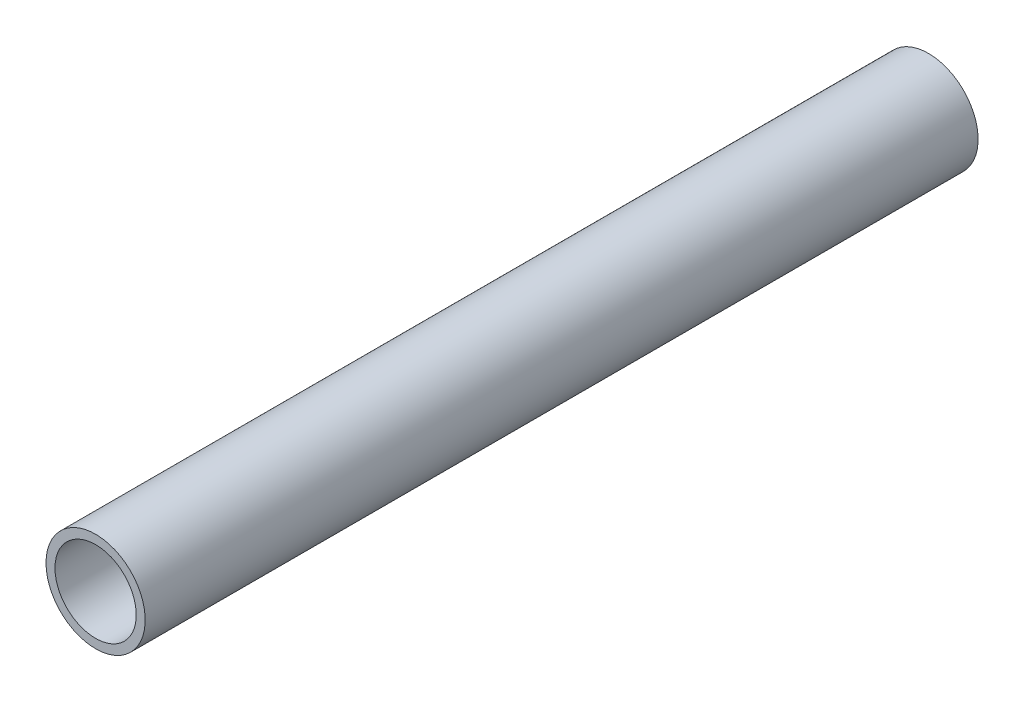
ISO-10303-21;
HEADER;
FILE_DESCRIPTION(('STEP AP214'),'2;1');
FILE_NAME('part.step','',(''),(''),'','','');
FILE_SCHEMA(('AUTOMOTIVE_DESIGN { 1 0 10303 214 1 1 1 1 }'));
ENDSEC;
DATA;
#1=APPLICATION_CONTEXT('core data for automotive mechanical design processes');
#2=APPLICATION_PROTOCOL_DEFINITION('international standard','automotive_design',2000,#1);
#3=PRODUCT_CONTEXT('',#1,'mechanical');
#4=PRODUCT('Part','Part','',(#3));
#5=PRODUCT_RELATED_PRODUCT_CATEGORY('part','',(#4));
#6=PRODUCT_DEFINITION_FORMATION('','',#4);
#7=PRODUCT_DEFINITION_CONTEXT('part definition',#1,'design');
#8=PRODUCT_DEFINITION('design','',#6,#7);
#9=PRODUCT_DEFINITION_SHAPE('','',#8);
#10=(LENGTH_UNIT() NAMED_UNIT(*) SI_UNIT(.MILLI.,.METRE.));
#11=(NAMED_UNIT(*) PLANE_ANGLE_UNIT() SI_UNIT($,.RADIAN.));
#12=(NAMED_UNIT(*) SI_UNIT($,.STERADIAN.) SOLID_ANGLE_UNIT());
#13=UNCERTAINTY_MEASURE_WITH_UNIT(LENGTH_MEASURE(1.E-05),#10,'distance_accuracy_value','');
#14=(GEOMETRIC_REPRESENTATION_CONTEXT(3) GLOBAL_UNCERTAINTY_ASSIGNED_CONTEXT((#13)) GLOBAL_UNIT_ASSIGNED_CONTEXT((#10,
#11,#12)) REPRESENTATION_CONTEXT('',''));
#15=CARTESIAN_POINT('',(0.,0.,0.));
#16=DIRECTION('',(0.,0.,1.));
#17=DIRECTION('',(1.,0.,0.));
#18=AXIS2_PLACEMENT_3D('',#15,#16,#17);
#19=CARTESIAN_POINT('',(0.,0.,354.0125));
#20=DIRECTION('',(0.,0.,-1.));
#21=DIRECTION('',(-1.,0.,0.));
#22=AXIS2_PLACEMENT_3D('',#19,#20,#21);
#23=CYLINDRICAL_SURFACE('',#22,17.272);
#24=CARTESIAN_POINT('',(0.,0.,354.0125));
#25=DIRECTION('',(0.,0.,1.));
#26=DIRECTION('',(1.,0.,0.));
#27=AXIS2_PLACEMENT_3D('',#24,#25,#26);
#28=CIRCLE('',#27,17.272);
#29=CARTESIAN_POINT('',(-17.272,0.,354.0125));
#30=VERTEX_POINT('',#29);
#31=EDGE_CURVE('E42',#30,#30,#28,.T.);
#32=CARTESIAN_POINT('',(0.,0.,0.));
#33=DIRECTION('',(0.,0.,1.));
#34=DIRECTION('',(1.,0.,0.));
#35=AXIS2_PLACEMENT_3D('',#32,#33,#34);
#36=CIRCLE('',#35,17.272);
#37=CARTESIAN_POINT('',(-17.272,0.,0.));
#38=VERTEX_POINT('',#37);
#39=EDGE_CURVE('E50',#38,#38,#36,.T.);
#40=CARTESIAN_POINT('',(-17.272,0.,354.0125));
#41=CARTESIAN_POINT('',(-17.272,0.,350.324869791667));
#42=CARTESIAN_POINT('',(-17.272,0.,346.637239583333));
#43=CARTESIAN_POINT('',(-17.272,0.,339.261979166667));
#44=CARTESIAN_POINT('',(-17.272,0.,335.574348958333));
#45=CARTESIAN_POINT('',(-17.272,0.,328.199088541667));
#46=CARTESIAN_POINT('',(-17.272,0.,324.511458333333));
#47=CARTESIAN_POINT('',(-17.272,0.,317.136197916667));
#48=CARTESIAN_POINT('',(-17.272,0.,313.448567708333));
#49=CARTESIAN_POINT('',(-17.272,0.,306.073307291667));
#50=CARTESIAN_POINT('',(-17.272,0.,302.385677083333));
#51=CARTESIAN_POINT('',(-17.272,0.,295.010416666667));
#52=CARTESIAN_POINT('',(-17.272,0.,291.322786458333));
#53=CARTESIAN_POINT('',(-17.272,0.,283.947526041667));
#54=CARTESIAN_POINT('',(-17.272,0.,280.259895833333));
#55=CARTESIAN_POINT('',(-17.272,0.,272.884635416667));
#56=CARTESIAN_POINT('',(-17.272,0.,269.197005208333));
#57=CARTESIAN_POINT('',(-17.272,0.,261.821744791667));
#58=CARTESIAN_POINT('',(-17.272,0.,258.134114583333));
#59=CARTESIAN_POINT('',(-17.272,0.,250.758854166667));
#60=CARTESIAN_POINT('',(-17.272,0.,247.071223958333));
#61=CARTESIAN_POINT('',(-17.272,0.,239.695963541667));
#62=CARTESIAN_POINT('',(-17.272,0.,236.008333333333));
#63=CARTESIAN_POINT('',(-17.272,0.,228.633072916667));
#64=CARTESIAN_POINT('',(-17.272,0.,224.945442708333));
#65=CARTESIAN_POINT('',(-17.272,0.,217.570182291667));
#66=CARTESIAN_POINT('',(-17.272,0.,213.882552083333));
#67=CARTESIAN_POINT('',(-17.272,0.,206.507291666667));
#68=CARTESIAN_POINT('',(-17.272,0.,202.819661458333));
#69=CARTESIAN_POINT('',(-17.272,0.,195.444401041667));
#70=CARTESIAN_POINT('',(-17.272,0.,191.756770833333));
#71=CARTESIAN_POINT('',(-17.272,0.,184.381510416667));
#72=CARTESIAN_POINT('',(-17.272,0.,180.693880208333));
#73=CARTESIAN_POINT('',(-17.272,0.,173.318619791667));
#74=CARTESIAN_POINT('',(-17.272,0.,169.630989583333));
#75=CARTESIAN_POINT('',(-17.272,0.,162.255729166667));
#76=CARTESIAN_POINT('',(-17.272,0.,158.568098958333));
#77=CARTESIAN_POINT('',(-17.272,0.,151.192838541667));
#78=CARTESIAN_POINT('',(-17.272,0.,147.505208333333));
#79=CARTESIAN_POINT('',(-17.272,0.,140.129947916667));
#80=CARTESIAN_POINT('',(-17.272,0.,136.442317708333));
#81=CARTESIAN_POINT('',(-17.272,0.,129.067057291667));
#82=CARTESIAN_POINT('',(-17.272,0.,125.379427083333));
#83=CARTESIAN_POINT('',(-17.272,0.,118.004166666667));
#84=CARTESIAN_POINT('',(-17.272,0.,114.316536458333));
#85=CARTESIAN_POINT('',(-17.272,0.,106.941276041667));
#86=CARTESIAN_POINT('',(-17.272,0.,103.253645833333));
#87=CARTESIAN_POINT('',(-17.272,0.,95.8783854166667));
#88=CARTESIAN_POINT('',(-17.272,0.,92.1907552083333));
#89=CARTESIAN_POINT('',(-17.272,0.,84.8154947916667));
#90=CARTESIAN_POINT('',(-17.272,0.,81.1278645833334));
#91=CARTESIAN_POINT('',(-17.272,0.,73.7526041666667));
#92=CARTESIAN_POINT('',(-17.272,0.,70.0649739583334));
#93=CARTESIAN_POINT('',(-17.272,0.,62.6897135416667));
#94=CARTESIAN_POINT('',(-17.272,0.,59.0020833333333));
#95=CARTESIAN_POINT('',(-17.272,0.,51.6268229166667));
#96=CARTESIAN_POINT('',(-17.272,0.,47.9391927083333));
#97=CARTESIAN_POINT('',(-17.272,0.,40.5639322916667));
#98=CARTESIAN_POINT('',(-17.272,0.,36.8763020833333));
#99=CARTESIAN_POINT('',(-17.272,0.,29.5010416666667));
#100=CARTESIAN_POINT('',(-17.272,0.,25.8134114583333));
#101=CARTESIAN_POINT('',(-17.272,0.,18.4381510416666));
#102=CARTESIAN_POINT('',(-17.272,0.,14.7505208333333));
#103=CARTESIAN_POINT('',(-17.272,0.,7.37526041666666));
#104=CARTESIAN_POINT('',(-17.272,0.,3.68763020833333));
#105=CARTESIAN_POINT('',(-17.272,0.,0.));
#106=B_SPLINE_CURVE_WITH_KNOTS('',3,(#40,#41,#42,#43,#44,#45,#46,#47,#48,#49,#50,#51,#52,#53,
#54,#55,#56,#57,#58,#59,#60,#61,#62,#63,#64,#65,#66,#67,#68,#69,#70,#71,#72,#73,#74,#75,#76,#77,
#78,#79,#80,#81,#82,#83,#84,#85,#86,#87,#88,#89,#90,#91,#92,#93,#94,#95,#96,#97,#98,#99,#100,
#101,#102,#103,#104,#105),.UNSPECIFIED.,.F.,.F.,(4,2,2,2,2,2,2,2,2,2,2,2,2,2,2,2,2,2,2,2,2,2,2,
2,2,2,2,2,2,2,2,2,4),(0.,11.062890625,22.12578125,33.188671875,44.2515625,55.314453125,
66.37734375,77.440234375,88.503125,99.5660156250001,110.62890625,121.691796875,132.7546875,
143.817578125,154.88046875,165.943359375,177.00625,188.069140625,199.13203125,210.194921875,
221.2578125,232.320703125,243.38359375,254.446484375,265.509375,276.572265625,287.63515625,
298.698046875,309.7609375,320.823828125,331.88671875,342.949609375,354.0125),.UNSPECIFIED.);
#107=EDGE_CURVE('BSEAM34',#30,#38,#106,.T.);
#108=ORIENTED_EDGE('',*,*,#31,.T.);
#109=ORIENTED_EDGE('',*,*,#39,.F.);
#110=ORIENTED_EDGE('',*,*,#107,.T.);
#111=ORIENTED_EDGE('',*,*,#107,.F.);
#112=EDGE_LOOP('',(#108,#110,#109,#111));
#113=FACE_BOUND('',#112,.T.);
#114=ADVANCED_FACE('F34',(#113),#23,.F.);
#115=CARTESIAN_POINT('',(0.,0.,354.0125));
#116=DIRECTION('',(0.,0.,-1.));
#117=DIRECTION('',(-1.,0.,0.));
#118=AXIS2_PLACEMENT_3D('',#115,#116,#117);
#119=CYLINDRICAL_SURFACE('',#118,21.082);
#120=CARTESIAN_POINT('',(0.,0.,354.0125));
#121=DIRECTION('',(0.,0.,1.));
#122=DIRECTION('',(1.,0.,0.));
#123=AXIS2_PLACEMENT_3D('',#120,#121,#122);
#124=CIRCLE('',#123,21.082);
#125=CARTESIAN_POINT('',(-21.082,0.,354.0125));
#126=VERTEX_POINT('',#125);
#127=EDGE_CURVE('E10',#126,#126,#124,.T.);
#128=CARTESIAN_POINT('',(0.,0.,0.));
#129=DIRECTION('',(0.,0.,1.));
#130=DIRECTION('',(1.,0.,0.));
#131=AXIS2_PLACEMENT_3D('',#128,#129,#130);
#132=CIRCLE('',#131,21.082);
#133=CARTESIAN_POINT('',(-21.082,0.,0.));
#134=VERTEX_POINT('',#133);
#135=EDGE_CURVE('E37',#134,#134,#132,.T.);
#136=CARTESIAN_POINT('',(-21.082,0.,354.0125));
#137=CARTESIAN_POINT('',(-21.082,0.,350.324869791667));
#138=CARTESIAN_POINT('',(-21.082,0.,346.637239583333));
#139=CARTESIAN_POINT('',(-21.082,0.,339.261979166667));
#140=CARTESIAN_POINT('',(-21.082,0.,335.574348958333));
#141=CARTESIAN_POINT('',(-21.082,0.,328.199088541667));
#142=CARTESIAN_POINT('',(-21.082,0.,324.511458333333));
#143=CARTESIAN_POINT('',(-21.082,0.,317.136197916667));
#144=CARTESIAN_POINT('',(-21.082,0.,313.448567708333));
#145=CARTESIAN_POINT('',(-21.082,0.,306.073307291667));
#146=CARTESIAN_POINT('',(-21.082,0.,302.385677083333));
#147=CARTESIAN_POINT('',(-21.082,0.,295.010416666667));
#148=CARTESIAN_POINT('',(-21.082,0.,291.322786458333));
#149=CARTESIAN_POINT('',(-21.082,0.,283.947526041667));
#150=CARTESIAN_POINT('',(-21.082,0.,280.259895833333));
#151=CARTESIAN_POINT('',(-21.082,0.,272.884635416667));
#152=CARTESIAN_POINT('',(-21.082,0.,269.197005208333));
#153=CARTESIAN_POINT('',(-21.082,0.,261.821744791667));
#154=CARTESIAN_POINT('',(-21.082,0.,258.134114583333));
#155=CARTESIAN_POINT('',(-21.082,0.,250.758854166667));
#156=CARTESIAN_POINT('',(-21.082,0.,247.071223958333));
#157=CARTESIAN_POINT('',(-21.082,0.,239.695963541667));
#158=CARTESIAN_POINT('',(-21.082,0.,236.008333333333));
#159=CARTESIAN_POINT('',(-21.082,0.,228.633072916667));
#160=CARTESIAN_POINT('',(-21.082,0.,224.945442708333));
#161=CARTESIAN_POINT('',(-21.082,0.,217.570182291667));
#162=CARTESIAN_POINT('',(-21.082,0.,213.882552083333));
#163=CARTESIAN_POINT('',(-21.082,0.,206.507291666667));
#164=CARTESIAN_POINT('',(-21.082,0.,202.819661458333));
#165=CARTESIAN_POINT('',(-21.082,0.,195.444401041667));
#166=CARTESIAN_POINT('',(-21.082,0.,191.756770833333));
#167=CARTESIAN_POINT('',(-21.082,0.,184.381510416667));
#168=CARTESIAN_POINT('',(-21.082,0.,180.693880208333));
#169=CARTESIAN_POINT('',(-21.082,0.,173.318619791667));
#170=CARTESIAN_POINT('',(-21.082,0.,169.630989583333));
#171=CARTESIAN_POINT('',(-21.082,0.,162.255729166667));
#172=CARTESIAN_POINT('',(-21.082,0.,158.568098958333));
#173=CARTESIAN_POINT('',(-21.082,0.,151.192838541667));
#174=CARTESIAN_POINT('',(-21.082,0.,147.505208333333));
#175=CARTESIAN_POINT('',(-21.082,0.,140.129947916667));
#176=CARTESIAN_POINT('',(-21.082,0.,136.442317708333));
#177=CARTESIAN_POINT('',(-21.082,0.,129.067057291667));
#178=CARTESIAN_POINT('',(-21.082,0.,125.379427083333));
#179=CARTESIAN_POINT('',(-21.082,0.,118.004166666667));
#180=CARTESIAN_POINT('',(-21.082,0.,114.316536458333));
#181=CARTESIAN_POINT('',(-21.082,0.,106.941276041667));
#182=CARTESIAN_POINT('',(-21.082,0.,103.253645833333));
#183=CARTESIAN_POINT('',(-21.082,0.,95.8783854166667));
#184=CARTESIAN_POINT('',(-21.082,0.,92.1907552083333));
#185=CARTESIAN_POINT('',(-21.082,0.,84.8154947916667));
#186=CARTESIAN_POINT('',(-21.082,0.,81.1278645833334));
#187=CARTESIAN_POINT('',(-21.082,0.,73.7526041666667));
#188=CARTESIAN_POINT('',(-21.082,0.,70.0649739583333));
#189=CARTESIAN_POINT('',(-21.082,0.,62.6897135416666));
#190=CARTESIAN_POINT('',(-21.082,0.,59.0020833333333));
#191=CARTESIAN_POINT('',(-21.082,0.,51.6268229166667));
#192=CARTESIAN_POINT('',(-21.082,0.,47.9391927083333));
#193=CARTESIAN_POINT('',(-21.082,0.,40.5639322916667));
#194=CARTESIAN_POINT('',(-21.082,0.,36.8763020833333));
#195=CARTESIAN_POINT('',(-21.082,0.,29.5010416666667));
#196=CARTESIAN_POINT('',(-21.082,0.,25.8134114583333));
#197=CARTESIAN_POINT('',(-21.082,0.,18.4381510416666));
#198=CARTESIAN_POINT('',(-21.082,0.,14.7505208333333));
#199=CARTESIAN_POINT('',(-21.082,0.,7.37526041666666));
#200=CARTESIAN_POINT('',(-21.082,0.,3.68763020833333));
#201=CARTESIAN_POINT('',(-21.082,0.,0.));
#202=B_SPLINE_CURVE_WITH_KNOTS('',3,(#136,#137,#138,#139,#140,#141,#142,#143,#144,#145,#146,
#147,#148,#149,#150,#151,#152,#153,#154,#155,#156,#157,#158,#159,#160,#161,#162,#163,#164,#165,
#166,#167,#168,#169,#170,#171,#172,#173,#174,#175,#176,#177,#178,#179,#180,#181,#182,#183,#184,
#185,#186,#187,#188,#189,#190,#191,#192,#193,#194,#195,#196,#197,#198,#199,#200,#201),
.UNSPECIFIED.,.F.,.F.,(4,2,2,2,2,2,2,2,2,2,2,2,2,2,2,2,2,2,2,2,2,2,2,2,2,2,2,2,2,2,2,2,4),(0.,
11.062890625,22.12578125,33.188671875,44.2515624999999,55.3144531249999,66.3773437499999,
77.440234375,88.503125,99.5660156249999,110.62890625,121.691796875,132.7546875,143.817578125,
154.88046875,165.943359375,177.00625,188.069140625,199.13203125,210.194921875,221.2578125,
232.320703125,243.38359375,254.446484375,265.509375,276.572265625,287.63515625,298.698046875,
309.7609375,320.823828125,331.88671875,342.949609375,354.0125),.UNSPECIFIED.);
#203=EDGE_CURVE('BSEAM61',#126,#134,#202,.T.);
#204=ORIENTED_EDGE('',*,*,#127,.F.);
#205=ORIENTED_EDGE('',*,*,#135,.T.);
#206=ORIENTED_EDGE('',*,*,#203,.T.);
#207=ORIENTED_EDGE('',*,*,#203,.F.);
#208=EDGE_LOOP('',(#204,#206,#205,#207));
#209=FACE_BOUND('',#208,.T.);
#210=ADVANCED_FACE('F61',(#209),#119,.T.);
#211=CARTESIAN_POINT('',(0.,0.,354.0125));
#212=DIRECTION('',(0.,0.,1.));
#213=DIRECTION('',(1.,0.,0.));
#214=AXIS2_PLACEMENT_3D('',#211,#212,#213);
#215=PLANE('',#214);
#216=ORIENTED_EDGE('',*,*,#31,.F.);
#217=EDGE_LOOP('',(#216));
#218=FACE_BOUND('',#217,.T.);
#219=ORIENTED_EDGE('',*,*,#127,.T.);
#220=EDGE_LOOP('',(#219));
#221=FACE_BOUND('',#220,.T.);
#222=ADVANCED_FACE('F65',(#218,#221),#215,.T.);
#223=CARTESIAN_POINT('',(0.,0.,0.));
#224=DIRECTION('',(0.,0.,1.));
#225=DIRECTION('',(1.,0.,0.));
#226=AXIS2_PLACEMENT_3D('',#223,#224,#225);
#227=PLANE('',#226);
#228=ORIENTED_EDGE('',*,*,#39,.T.);
#229=EDGE_LOOP('',(#228));
#230=FACE_BOUND('',#229,.T.);
#231=ORIENTED_EDGE('',*,*,#135,.F.);
#232=EDGE_LOOP('',(#231));
#233=FACE_BOUND('',#232,.T.);
#234=ADVANCED_FACE('F63',(#230,#233),#227,.F.);
#235=CLOSED_SHELL('',(#114,#210,#222,#234));
#236=MANIFOLD_SOLID_BREP('B2',#235);
#237=ADVANCED_BREP_SHAPE_REPRESENTATION('',(#18,#236),#14);
#238=SHAPE_DEFINITION_REPRESENTATION(#9,#237);
ENDSEC;
END-ISO-10303-21;
